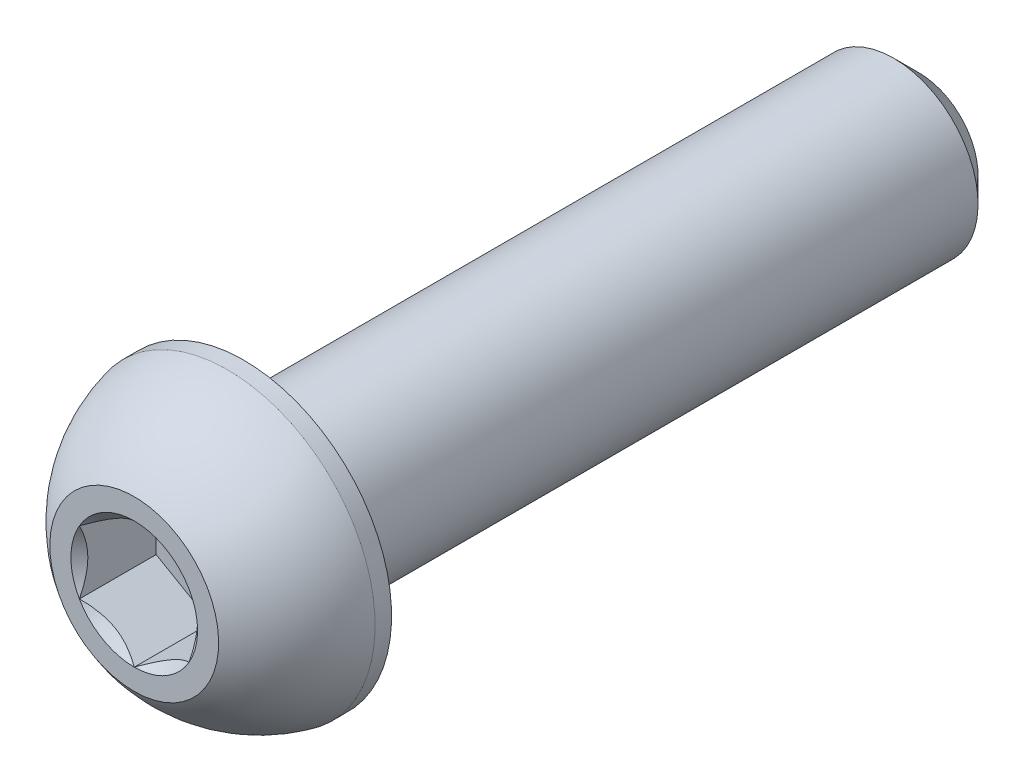
ISO-10303-21;
HEADER;
FILE_DESCRIPTION(('STEP AP214'),'2;1');
FILE_NAME('part.step','',(''),(''),'','','');
FILE_SCHEMA(('AUTOMOTIVE_DESIGN { 1 0 10303 214 1 1 1 1 }'));
ENDSEC;
DATA;
#1=APPLICATION_CONTEXT('core data for automotive mechanical design processes');
#2=APPLICATION_PROTOCOL_DEFINITION('international standard','automotive_design',2000,#1);
#3=PRODUCT_CONTEXT('',#1,'mechanical');
#4=PRODUCT('Part','Part','',(#3));
#5=PRODUCT_RELATED_PRODUCT_CATEGORY('part','',(#4));
#6=PRODUCT_DEFINITION_FORMATION('','',#4);
#7=PRODUCT_DEFINITION_CONTEXT('part definition',#1,'design');
#8=PRODUCT_DEFINITION('design','',#6,#7);
#9=PRODUCT_DEFINITION_SHAPE('','',#8);
#10=(LENGTH_UNIT() NAMED_UNIT(*) SI_UNIT(.MILLI.,.METRE.));
#11=(NAMED_UNIT(*) PLANE_ANGLE_UNIT() SI_UNIT($,.RADIAN.));
#12=(NAMED_UNIT(*) SI_UNIT($,.STERADIAN.) SOLID_ANGLE_UNIT());
#13=UNCERTAINTY_MEASURE_WITH_UNIT(LENGTH_MEASURE(1.E-05),#10,'distance_accuracy_value','');
#14=(GEOMETRIC_REPRESENTATION_CONTEXT(3) GLOBAL_UNCERTAINTY_ASSIGNED_CONTEXT((#13)) GLOBAL_UNIT_ASSIGNED_CONTEXT((#10,
#11,#12)) REPRESENTATION_CONTEXT('',''));
#15=CARTESIAN_POINT('',(0.,0.,0.));
#16=DIRECTION('',(0.,0.,1.));
#17=DIRECTION('',(1.,0.,0.));
#18=AXIS2_PLACEMENT_3D('',#15,#16,#17);
#19=CARTESIAN_POINT('',(0.,-0.750555349946513,-0.91));
#20=DIRECTION('',(0.5,-0.866025403784439,0.));
#21=DIRECTION('',(0.,0.,-1.));
#22=AXIS2_PLACEMENT_3D('',#19,#20,#21);
#23=PLANE('',#22);
#24=DIRECTION('',(0.,0.,1.));
#25=VECTOR('',#24,1.);
#26=CARTESIAN_POINT('',(0.,-0.750555349946513,-0.91));
#27=LINE('',#26,#25);
#28=CARTESIAN_POINT('',(0.,-0.750555349946513,-0.91));
#29=VERTEX_POINT('',#28);
#30=CARTESIAN_POINT('',(0.,-0.750555349946513,0.));
#31=VERTEX_POINT('',#30);
#32=EDGE_CURVE('E11',#29,#31,#27,.T.);
#33=ORIENTED_EDGE('',*,*,#32,.T.);
#34=CARTESIAN_POINT('',(2.25396322591972E-12,-0.750555349945212,-1.30128767060624E-12));
#35=CARTESIAN_POINT('',(0.325,-0.562916512459885,-0.187638837485652));
#36=CARTESIAN_POINT('',(0.649999999997747,-0.375277674974557,-1.30106096261599E-12));
#37=(BOUNDED_CURVE() B_SPLINE_CURVE(2,(#34,#35,#36),.UNSPECIFIED.,.F.,
.F.) B_SPLINE_CURVE_WITH_KNOTS((3,3),(-0.273975193232128,-0.118614470998721),
.UNSPECIFIED.) CURVE() GEOMETRIC_REPRESENTATION_ITEM() RATIONAL_B_SPLINE_CURVE((1.71400248482891,
1.97915959201189,1.71400248482891)) REPRESENTATION_ITEM(''));
#38=CARTESIAN_POINT('',(0.65,-0.375277674973256,0.));
#39=VERTEX_POINT('',#38);
#40=EDGE_CURVE('E116',#31,#39,#37,.T.);
#41=ORIENTED_EDGE('',*,*,#40,.T.);
#42=DIRECTION('',(0.,0.,1.));
#43=VECTOR('',#42,1.);
#44=CARTESIAN_POINT('',(0.65,-0.375277674973256,-0.91));
#45=LINE('',#44,#43);
#46=CARTESIAN_POINT('',(0.65,-0.375277674973256,-0.91));
#47=VERTEX_POINT('',#46);
#48=EDGE_CURVE('E111',#47,#39,#45,.T.);
#49=ORIENTED_EDGE('',*,*,#48,.F.);
#50=DIRECTION('',(0.866025403784439,0.5,0.));
#51=VECTOR('',#50,1.);
#52=CARTESIAN_POINT('',(0.,-0.750555349946513,-0.91));
#53=LINE('',#52,#51);
#54=EDGE_CURVE('E114',#29,#47,#53,.T.);
#55=ORIENTED_EDGE('',*,*,#54,.F.);
#56=EDGE_LOOP('',(#33,#41,#49,#55));
#57=FACE_BOUND('',#56,.T.);
#58=ADVANCED_FACE('F17',(#57),#23,.F.);
#59=CARTESIAN_POINT('',(-0.65,-0.375277674973257,-0.91));
#60=DIRECTION('',(-0.5,-0.866025403784439,0.));
#61=DIRECTION('',(-0.866025403784439,0.5,0.));
#62=AXIS2_PLACEMENT_3D('',#59,#60,#61);
#63=PLANE('',#62);
#64=DIRECTION('',(0.,0.,1.));
#65=VECTOR('',#64,1.);
#66=CARTESIAN_POINT('',(-0.65,-0.375277674973257,-0.91));
#67=LINE('',#66,#65);
#68=CARTESIAN_POINT('',(-0.65,-0.375277674973257,-0.91));
#69=VERTEX_POINT('',#68);
#70=CARTESIAN_POINT('',(-0.65,-0.375277674973257,0.));
#71=VERTEX_POINT('',#70);
#72=EDGE_CURVE('E28',#69,#71,#67,.T.);
#73=ORIENTED_EDGE('',*,*,#72,.T.);
#74=CARTESIAN_POINT('',(-0.649999999997745,-0.375277674974559,-1.30208114857212E-12));
#75=CARTESIAN_POINT('',(-0.325,-0.562916512459885,-0.187638837485651));
#76=CARTESIAN_POINT('',(-2.25376890478522E-12,-0.750555349945212,-1.30122289689474E-12));
#77=(BOUNDED_CURVE() B_SPLINE_CURVE(2,(#74,#75,#76),.UNSPECIFIED.,.F.,
.F.) B_SPLINE_CURVE_WITH_KNOTS((3,3),(-0.273975193232128,-0.118614470998721),
.UNSPECIFIED.) CURVE() GEOMETRIC_REPRESENTATION_ITEM() RATIONAL_B_SPLINE_CURVE((1.71400248482891,
1.97915959201189,1.71400248482891)) REPRESENTATION_ITEM(''));
#78=EDGE_CURVE('E139',#71,#31,#77,.T.);
#79=ORIENTED_EDGE('',*,*,#78,.T.);
#80=ORIENTED_EDGE('',*,*,#32,.F.);
#81=DIRECTION('',(0.866025403784439,-0.5,0.));
#82=VECTOR('',#81,1.);
#83=CARTESIAN_POINT('',(-0.65,-0.375277674973257,-0.91));
#84=LINE('',#83,#82);
#85=EDGE_CURVE('E122',#69,#29,#84,.T.);
#86=ORIENTED_EDGE('',*,*,#85,.F.);
#87=EDGE_LOOP('',(#73,#79,#80,#86));
#88=FACE_BOUND('',#87,.T.);
#89=ADVANCED_FACE('F297',(#88),#63,.F.);
#90=CARTESIAN_POINT('',(-0.65,0.375277674973256,-0.91));
#91=DIRECTION('',(-1.,0.,0.));
#92=DIRECTION('',(0.,0.,1.));
#93=AXIS2_PLACEMENT_3D('',#90,#91,#92);
#94=PLANE('',#93);
#95=DIRECTION('',(0.,0.,1.));
#96=VECTOR('',#95,1.);
#97=CARTESIAN_POINT('',(-0.65,0.375277674973256,-0.91));
#98=LINE('',#97,#96);
#99=CARTESIAN_POINT('',(-0.65,0.375277674973256,-0.91));
#100=VERTEX_POINT('',#99);
#101=CARTESIAN_POINT('',(-0.65,0.375277674973256,0.));
#102=VERTEX_POINT('',#101);
#103=EDGE_CURVE('E144',#100,#102,#98,.T.);
#104=ORIENTED_EDGE('',*,*,#103,.T.);
#105=CARTESIAN_POINT('',(-0.65,0.375277674970655,-1.30057515977974E-12));
#106=CARTESIAN_POINT('',(-0.650000000000001,0.,-0.187638837485652));
#107=CARTESIAN_POINT('',(-0.65,-0.375277674970655,-1.30081806119787E-12));
#108=(BOUNDED_CURVE() B_SPLINE_CURVE(2,(#105,#106,#107),.UNSPECIFIED.,.F.,
.F.) B_SPLINE_CURVE_WITH_KNOTS((3,3),(-0.273975193232128,-0.118614470998721),
.UNSPECIFIED.) CURVE() GEOMETRIC_REPRESENTATION_ITEM() RATIONAL_B_SPLINE_CURVE((1.71400248482891,
1.97915959201189,1.71400248482891)) REPRESENTATION_ITEM(''));
#109=EDGE_CURVE('E182',#102,#71,#108,.T.);
#110=ORIENTED_EDGE('',*,*,#109,.T.);
#111=ORIENTED_EDGE('',*,*,#72,.F.);
#112=DIRECTION('',(0.,-1.,0.));
#113=VECTOR('',#112,1.);
#114=CARTESIAN_POINT('',(-0.65,0.375277674973256,-0.91));
#115=LINE('',#114,#113);
#116=EDGE_CURVE('E196',#100,#69,#115,.T.);
#117=ORIENTED_EDGE('',*,*,#116,.F.);
#118=EDGE_LOOP('',(#104,#110,#111,#117));
#119=FACE_BOUND('',#118,.T.);
#120=ADVANCED_FACE('F302',(#119),#94,.F.);
#121=CARTESIAN_POINT('',(0.,0.750555349946513,-0.91));
#122=DIRECTION('',(-0.5,0.866025403784439,0.));
#123=DIRECTION('',(0.,0.,1.));
#124=AXIS2_PLACEMENT_3D('',#121,#122,#123);
#125=PLANE('',#124);
#126=DIRECTION('',(0.,0.,1.));
#127=VECTOR('',#126,1.);
#128=CARTESIAN_POINT('',(0.,0.750555349946513,-0.91));
#129=LINE('',#128,#127);
#130=CARTESIAN_POINT('',(0.,0.750555349946513,-0.91));
#131=VERTEX_POINT('',#130);
#132=CARTESIAN_POINT('',(0.,0.750555349946513,0.));
#133=VERTEX_POINT('',#132);
#134=EDGE_CURVE('E142',#131,#133,#129,.T.);
#135=ORIENTED_EDGE('',*,*,#134,.T.);
#136=CARTESIAN_POINT('',(-2.25399561277547E-12,0.750555349945212,-1.30106096261599E-12));
#137=CARTESIAN_POINT('',(-0.325,0.562916512459885,-0.187638837485652));
#138=CARTESIAN_POINT('',(-0.649999999997747,0.375277674974557,-1.30068851377487E-12));
#139=(BOUNDED_CURVE() B_SPLINE_CURVE(2,(#136,#137,#138),.UNSPECIFIED.,.F.,
.F.) B_SPLINE_CURVE_WITH_KNOTS((3,3),(-0.273975193232128,-0.118614470998721),
.UNSPECIFIED.) CURVE() GEOMETRIC_REPRESENTATION_ITEM() RATIONAL_B_SPLINE_CURVE((1.71400248482891,
1.97915959201188,1.71400248482891)) REPRESENTATION_ITEM(''));
#140=EDGE_CURVE('E176',#133,#102,#139,.T.);
#141=ORIENTED_EDGE('',*,*,#140,.T.);
#142=ORIENTED_EDGE('',*,*,#103,.F.);
#143=DIRECTION('',(-0.866025403784439,-0.5,0.));
#144=VECTOR('',#143,1.);
#145=CARTESIAN_POINT('',(0.,0.750555349946513,-0.91));
#146=LINE('',#145,#144);
#147=EDGE_CURVE('E192',#131,#100,#146,.T.);
#148=ORIENTED_EDGE('',*,*,#147,.F.);
#149=EDGE_LOOP('',(#135,#141,#142,#148));
#150=FACE_BOUND('',#149,.T.);
#151=ADVANCED_FACE('F314',(#150),#125,.F.);
#152=CARTESIAN_POINT('',(0.65,0.375277674973257,-0.91));
#153=DIRECTION('',(0.5,0.866025403784439,0.));
#154=DIRECTION('',(0.,0.,-1.));
#155=AXIS2_PLACEMENT_3D('',#152,#153,#154);
#156=PLANE('',#155);
#157=DIRECTION('',(0.,0.,1.));
#158=VECTOR('',#157,1.);
#159=CARTESIAN_POINT('',(0.65,0.375277674973257,-0.91));
#160=LINE('',#159,#158);
#161=CARTESIAN_POINT('',(0.65,0.375277674973257,-0.91));
#162=VERTEX_POINT('',#161);
#163=CARTESIAN_POINT('',(0.65,0.375277674973256,0.));
#164=VERTEX_POINT('',#163);
#165=EDGE_CURVE('E121',#162,#164,#160,.T.);
#166=ORIENTED_EDGE('',*,*,#165,.T.);
#167=CARTESIAN_POINT('',(0.649999999997745,0.375277674974559,-1.30214592228362E-12));
#168=CARTESIAN_POINT('',(0.324999999999999,0.562916512459886,-0.187638837485652));
#169=CARTESIAN_POINT('',(2.25279729911272E-12,0.750555349945212,-1.30070470720274E-12));
#170=(BOUNDED_CURVE() B_SPLINE_CURVE(2,(#167,#168,#169),.UNSPECIFIED.,.F.,
.F.) B_SPLINE_CURVE_WITH_KNOTS((3,3),(-0.273975193232128,-0.11861447099872),
.UNSPECIFIED.) CURVE() GEOMETRIC_REPRESENTATION_ITEM() RATIONAL_B_SPLINE_CURVE((1.71400248482891,
1.97915959201189,1.71400248482891)) REPRESENTATION_ITEM(''));
#171=EDGE_CURVE('E183',#164,#133,#170,.T.);
#172=ORIENTED_EDGE('',*,*,#171,.T.);
#173=ORIENTED_EDGE('',*,*,#134,.F.);
#174=DIRECTION('',(-0.866025403784439,0.5,0.));
#175=VECTOR('',#174,1.);
#176=CARTESIAN_POINT('',(0.65,0.375277674973257,-0.91));
#177=LINE('',#176,#175);
#178=EDGE_CURVE('E21',#162,#131,#177,.T.);
#179=ORIENTED_EDGE('',*,*,#178,.F.);
#180=EDGE_LOOP('',(#166,#172,#173,#179));
#181=FACE_BOUND('',#180,.T.);
#182=ADVANCED_FACE('F311',(#181),#156,.F.);
#183=CARTESIAN_POINT('',(0.65,-0.375277674973256,-0.91));
#184=DIRECTION('',(1.,0.,0.));
#185=DIRECTION('',(0.,1.,0.));
#186=AXIS2_PLACEMENT_3D('',#183,#184,#185);
#187=PLANE('',#186);
#188=ORIENTED_EDGE('',*,*,#48,.T.);
#189=CARTESIAN_POINT('',(0.65,-0.375277674970655,-1.30067232034699E-12));
#190=CARTESIAN_POINT('',(0.650000000000001,0.,-0.187638837485652));
#191=CARTESIAN_POINT('',(0.65,0.375277674970654,-1.30085044805362E-12));
#192=(BOUNDED_CURVE() B_SPLINE_CURVE(2,(#189,#190,#191),.UNSPECIFIED.,.F.,
.F.) B_SPLINE_CURVE_WITH_KNOTS((3,3),(-0.273975193232128,-0.118614470998721),
.UNSPECIFIED.) CURVE() GEOMETRIC_REPRESENTATION_ITEM() RATIONAL_B_SPLINE_CURVE((1.71400248482891,
1.97915959201189,1.71400248482891)) REPRESENTATION_ITEM(''));
#193=EDGE_CURVE('E228',#39,#164,#192,.T.);
#194=ORIENTED_EDGE('',*,*,#193,.T.);
#195=ORIENTED_EDGE('',*,*,#165,.F.);
#196=DIRECTION('',(0.,1.,0.));
#197=VECTOR('',#196,1.);
#198=CARTESIAN_POINT('',(0.65,-0.375277674973256,-0.91));
#199=LINE('',#198,#197);
#200=EDGE_CURVE('E125',#47,#162,#199,.T.);
#201=ORIENTED_EDGE('',*,*,#200,.F.);
#202=EDGE_LOOP('',(#188,#194,#195,#201));
#203=FACE_BOUND('',#202,.T.);
#204=ADVANCED_FACE('F126',(#203),#187,.F.);
#205=CARTESIAN_POINT('',(0.65,-0.375277674973256,-0.91));
#206=DIRECTION('',(0.,0.,1.));
#207=DIRECTION('',(1.,0.,0.));
#208=AXIS2_PLACEMENT_3D('',#205,#206,#207);
#209=PLANE('',#208);
#210=ORIENTED_EDGE('',*,*,#54,.T.);
#211=ORIENTED_EDGE('',*,*,#200,.T.);
#212=ORIENTED_EDGE('',*,*,#178,.T.);
#213=ORIENTED_EDGE('',*,*,#147,.T.);
#214=ORIENTED_EDGE('',*,*,#116,.T.);
#215=ORIENTED_EDGE('',*,*,#85,.T.);
#216=EDGE_LOOP('',(#210,#211,#212,#213,#214,#215));
#217=FACE_BOUND('',#216,.T.);
#218=ADVANCED_FACE('F132',(#217),#209,.T.);
#219=CARTESIAN_POINT('',(0.,0.,0.));
#220=DIRECTION('',(0.,0.,1.));
#221=DIRECTION('',(1.,0.,0.));
#222=AXIS2_PLACEMENT_3D('',#219,#220,#221);
#223=CONICAL_SURFACE('',#222,0.750555349946513,0.78539816339745);
#224=CARTESIAN_POINT('',(0.,0.,0.));
#225=DIRECTION('',(0.,0.,1.));
#226=DIRECTION('',(1.,0.,0.));
#227=AXIS2_PLACEMENT_3D('',#224,#225,#226);
#228=CIRCLE('',#227,0.750555349946513);
#229=EDGE_CURVE('E163',#31,#39,#228,.T.);
#230=ORIENTED_EDGE('',*,*,#229,.T.);
#231=ORIENTED_EDGE('',*,*,#40,.F.);
#232=EDGE_LOOP('',(#230,#231));
#233=FACE_BOUND('',#232,.T.);
#234=ADVANCED_FACE('F19',(#233),#223,.F.);
#235=CARTESIAN_POINT('',(0.,0.,0.));
#236=DIRECTION('',(0.,0.,1.));
#237=DIRECTION('',(1.,0.,0.));
#238=AXIS2_PLACEMENT_3D('',#235,#236,#237);
#239=CONICAL_SURFACE('',#238,0.750555349946513,0.78539816339745);
#240=CARTESIAN_POINT('',(0.,0.,0.));
#241=DIRECTION('',(0.,0.,1.));
#242=DIRECTION('',(1.,0.,0.));
#243=AXIS2_PLACEMENT_3D('',#240,#241,#242);
#244=CIRCLE('',#243,0.750555349946513);
#245=EDGE_CURVE('E166',#71,#31,#244,.T.);
#246=ORIENTED_EDGE('',*,*,#245,.T.);
#247=ORIENTED_EDGE('',*,*,#78,.F.);
#248=EDGE_LOOP('',(#246,#247));
#249=FACE_BOUND('',#248,.T.);
#250=ADVANCED_FACE('F306',(#249),#239,.F.);
#251=CARTESIAN_POINT('',(0.,0.,0.));
#252=DIRECTION('',(0.,0.,1.));
#253=DIRECTION('',(-1.,0.,0.));
#254=AXIS2_PLACEMENT_3D('',#251,#252,#253);
#255=CONICAL_SURFACE('',#254,0.750555349946513,0.78539816339745);
#256=CARTESIAN_POINT('',(0.,0.,0.));
#257=DIRECTION('',(0.,0.,1.));
#258=DIRECTION('',(1.,0.,0.));
#259=AXIS2_PLACEMENT_3D('',#256,#257,#258);
#260=CIRCLE('',#259,0.750555349946513);
#261=EDGE_CURVE('E168',#102,#71,#260,.T.);
#262=ORIENTED_EDGE('',*,*,#261,.T.);
#263=ORIENTED_EDGE('',*,*,#109,.F.);
#264=EDGE_LOOP('',(#262,#263));
#265=FACE_BOUND('',#264,.T.);
#266=ADVANCED_FACE('F309',(#265),#255,.F.);
#267=CARTESIAN_POINT('',(0.,0.,0.));
#268=DIRECTION('',(0.,0.,1.));
#269=DIRECTION('',(1.,0.,0.));
#270=AXIS2_PLACEMENT_3D('',#267,#268,#269);
#271=CONICAL_SURFACE('',#270,0.750555349946513,0.78539816339745);
#272=CARTESIAN_POINT('',(0.,0.,0.));
#273=DIRECTION('',(0.,0.,1.));
#274=DIRECTION('',(1.,0.,0.));
#275=AXIS2_PLACEMENT_3D('',#272,#273,#274);
#276=CIRCLE('',#275,0.750555349946513);
#277=EDGE_CURVE('E171',#133,#102,#276,.T.);
#278=ORIENTED_EDGE('',*,*,#277,.T.);
#279=ORIENTED_EDGE('',*,*,#140,.F.);
#280=EDGE_LOOP('',(#278,#279));
#281=FACE_BOUND('',#280,.T.);
#282=ADVANCED_FACE('F291',(#281),#271,.F.);
#283=CARTESIAN_POINT('',(0.,0.,0.));
#284=DIRECTION('',(0.,0.,1.));
#285=DIRECTION('',(1.,0.,0.));
#286=AXIS2_PLACEMENT_3D('',#283,#284,#285);
#287=CONICAL_SURFACE('',#286,0.750555349946513,0.78539816339745);
#288=CARTESIAN_POINT('',(0.,0.,0.));
#289=DIRECTION('',(0.,0.,1.));
#290=DIRECTION('',(1.,0.,0.));
#291=AXIS2_PLACEMENT_3D('',#288,#289,#290);
#292=CIRCLE('',#291,0.750555349946513);
#293=EDGE_CURVE('E167',#164,#133,#292,.T.);
#294=ORIENTED_EDGE('',*,*,#293,.T.);
#295=ORIENTED_EDGE('',*,*,#171,.F.);
#296=EDGE_LOOP('',(#294,#295));
#297=FACE_BOUND('',#296,.T.);
#298=ADVANCED_FACE('F280',(#297),#287,.F.);
#299=CARTESIAN_POINT('',(0.,-1.75,-1.3));
#300=DIRECTION('',(0.,0.,1.));
#301=DIRECTION('',(1.,0.,0.));
#302=AXIS2_PLACEMENT_3D('',#299,#300,#301);
#303=PLANE('',#302);
#304=CARTESIAN_POINT('',(0.,0.,-1.3));
#305=DIRECTION('',(0.,0.,-1.));
#306=DIRECTION('',(0.,-1.,0.));
#307=AXIS2_PLACEMENT_3D('',#304,#305,#306);
#308=CIRCLE('',#307,1.);
#309=CARTESIAN_POINT('',(0.,1.,-1.3));
#310=VERTEX_POINT('',#309);
#311=EDGE_CURVE('E211',#310,#310,#308,.T.);
#312=ORIENTED_EDGE('',*,*,#311,.F.);
#313=EDGE_LOOP('',(#312));
#314=FACE_BOUND('',#313,.T.);
#315=CARTESIAN_POINT('',(0.,0.,-1.3));
#316=DIRECTION('',(0.,0.,1.));
#317=DIRECTION('',(1.,0.,0.));
#318=AXIS2_PLACEMENT_3D('',#315,#316,#317);
#319=CIRCLE('',#318,1.75);
#320=CARTESIAN_POINT('',(-1.75,0.,-1.3));
#321=VERTEX_POINT('',#320);
#322=EDGE_CURVE('E157',#321,#321,#319,.T.);
#323=ORIENTED_EDGE('',*,*,#322,.F.);
#324=EDGE_LOOP('',(#323));
#325=FACE_BOUND('',#324,.T.);
#326=ADVANCED_FACE('F278',(#314,#325),#303,.F.);
#327=CARTESIAN_POINT('',(0.,-1.,0.));
#328=DIRECTION('',(0.,0.,-1.));
#329=DIRECTION('',(0.,-1.,0.));
#330=AXIS2_PLACEMENT_3D('',#327,#328,#329);
#331=PLANE('',#330);
#332=ORIENTED_EDGE('',*,*,#261,.F.);
#333=ORIENTED_EDGE('',*,*,#277,.F.);
#334=ORIENTED_EDGE('',*,*,#293,.F.);
#335=CARTESIAN_POINT('',(0.,0.,0.));
#336=DIRECTION('',(0.,0.,1.));
#337=DIRECTION('',(1.,0.,0.));
#338=AXIS2_PLACEMENT_3D('',#335,#336,#337);
#339=CIRCLE('',#338,0.750555349946513);
#340=EDGE_CURVE('E156',#39,#164,#339,.T.);
#341=ORIENTED_EDGE('',*,*,#340,.F.);
#342=ORIENTED_EDGE('',*,*,#229,.F.);
#343=ORIENTED_EDGE('',*,*,#245,.F.);
#344=EDGE_LOOP('',(#332,#333,#334,#341,#342,#343));
#345=FACE_BOUND('',#344,.T.);
#346=CARTESIAN_POINT('',(0.,0.,0.));
#347=DIRECTION('',(0.,0.,1.));
#348=DIRECTION('',(1.,0.,0.));
#349=AXIS2_PLACEMENT_3D('',#346,#347,#348);
#350=CIRCLE('',#349,1.);
#351=CARTESIAN_POINT('',(0.,-1.,0.));
#352=VERTEX_POINT('',#351);
#353=EDGE_CURVE('E160',#352,#352,#350,.T.);
#354=ORIENTED_EDGE('',*,*,#353,.T.);
#355=EDGE_LOOP('',(#354));
#356=FACE_BOUND('',#355,.T.);
#357=ADVANCED_FACE('F266',(#345,#356),#331,.F.);
#358=CARTESIAN_POINT('',(0.,-1.00000000000014,-9.3));
#359=DIRECTION('',(0.,0.,-1.));
#360=DIRECTION('',(-1.,0.,0.));
#361=AXIS2_PLACEMENT_3D('',#358,#359,#360);
#362=PLANE('',#361);
#363=CARTESIAN_POINT('',(0.,-1.41674866283026E-13,-9.3));
#364=DIRECTION('',(0.,0.,-1.));
#365=DIRECTION('',(0.,1.,0.));
#366=AXIS2_PLACEMENT_3D('',#363,#364,#365);
#367=CIRCLE('',#366,0.7);
#368=CARTESIAN_POINT('',(0.,0.699999999999861,-9.3));
#369=VERTEX_POINT('',#368);
#370=EDGE_CURVE('E235',#369,#369,#367,.T.);
#371=ORIENTED_EDGE('',*,*,#370,.T.);
#372=EDGE_LOOP('',(#371));
#373=FACE_BOUND('',#372,.T.);
#374=ADVANCED_FACE('F288',(#373),#362,.T.);
#375=CARTESIAN_POINT('',(0.,0.,-13.3));
#376=DIRECTION('',(0.,0.,1.));
#377=DIRECTION('',(0.,-1.,0.));
#378=AXIS2_PLACEMENT_3D('',#375,#376,#377);
#379=CYLINDRICAL_SURFACE('',#378,1.);
#380=ORIENTED_EDGE('',*,*,#311,.T.);
#381=DIRECTION('',(0.,0.,-1.));
#382=VECTOR('',#381,1.);
#383=CARTESIAN_POINT('',(0.,1.,-13.3));
#384=LINE('',#383,#382);
#385=CARTESIAN_POINT('',(0.,0.999999999999863,-9.));
#386=VERTEX_POINT('',#385);
#387=EDGE_CURVE('E172',#310,#386,#384,.T.);
#388=ORIENTED_EDGE('',*,*,#387,.T.);
#389=CARTESIAN_POINT('',(0.,-1.37189869067802E-13,-9.));
#390=DIRECTION('',(0.,0.,-1.));
#391=DIRECTION('',(0.,-1.,0.));
#392=AXIS2_PLACEMENT_3D('',#389,#390,#391);
#393=CIRCLE('',#392,1.);
#394=EDGE_CURVE('E184',#386,#386,#393,.T.);
#395=ORIENTED_EDGE('',*,*,#394,.F.);
#396=ORIENTED_EDGE('',*,*,#387,.F.);
#397=EDGE_LOOP('',(#380,#388,#395,#396));
#398=FACE_BOUND('',#397,.T.);
#399=ADVANCED_FACE('F272',(#398),#379,.T.);
#400=CARTESIAN_POINT('',(0.,0.,-1.48575791855204));
#401=DIRECTION('',(1.,0.,0.));
#402=DIRECTION('',(0.,-1.,0.));
#403=AXIS2_PLACEMENT_3D('',#400,#401,#402);
#404=SPHERICAL_SURFACE('',#403,1.790942933915);
#405=CARTESIAN_POINT('',(0.,0.,-1.48575791855204));
#406=DIRECTION('',(0.,0.,1.));
#407=DIRECTION('',(1.,0.,0.));
#408=AXIS2_PLACEMENT_3D('',#405,#406,#407);
#409=SPHERICAL_SURFACE('',#408,1.790942933915);
#410=ORIENTED_EDGE('',*,*,#353,.F.);
#411=EDGE_LOOP('',(#410));
#412=FACE_BOUND('',#411,.T.);
#413=CARTESIAN_POINT('',(0.,0.,-1.105));
#414=DIRECTION('',(0.,0.,1.));
#415=DIRECTION('',(1.,0.,0.));
#416=AXIS2_PLACEMENT_3D('',#413,#414,#415);
#417=CIRCLE('',#416,1.75);
#418=CARTESIAN_POINT('',(-1.75,0.,-1.105));
#419=VERTEX_POINT('',#418);
#420=EDGE_CURVE('E148',#419,#419,#417,.T.);
#421=ORIENTED_EDGE('',*,*,#420,.T.);
#422=EDGE_LOOP('',(#421));
#423=FACE_BOUND('',#422,.T.);
#424=ADVANCED_FACE('F268',(#412,#423),#409,.T.);
#425=CARTESIAN_POINT('',(0.,0.,0.));
#426=DIRECTION('',(0.,0.,1.));
#427=DIRECTION('',(1.,0.,0.));
#428=AXIS2_PLACEMENT_3D('',#425,#426,#427);
#429=CYLINDRICAL_SURFACE('',#428,1.75);
#430=ORIENTED_EDGE('',*,*,#420,.F.);
#431=DIRECTION('',(0.,0.,-1.));
#432=VECTOR('',#431,1.);
#433=CARTESIAN_POINT('',(-1.75,0.,0.));
#434=LINE('',#433,#432);
#435=EDGE_CURVE('E155',#419,#321,#434,.T.);
#436=ORIENTED_EDGE('',*,*,#435,.T.);
#437=ORIENTED_EDGE('',*,*,#322,.T.);
#438=ORIENTED_EDGE('',*,*,#435,.F.);
#439=EDGE_LOOP('',(#430,#436,#437,#438));
#440=FACE_BOUND('',#439,.T.);
#441=ADVANCED_FACE('F271',(#440),#429,.T.);
#442=CARTESIAN_POINT('',(0.,0.,0.));
#443=DIRECTION('',(0.,0.,1.));
#444=DIRECTION('',(1.,0.,0.));
#445=AXIS2_PLACEMENT_3D('',#442,#443,#444);
#446=CONICAL_SURFACE('',#445,0.750555349946513,0.78539816339745);
#447=ORIENTED_EDGE('',*,*,#193,.F.);
#448=ORIENTED_EDGE('',*,*,#340,.T.);
#449=EDGE_LOOP('',(#447,#448));
#450=FACE_BOUND('',#449,.T.);
#451=ADVANCED_FACE('F319',(#450),#446,.F.);
#452=CARTESIAN_POINT('',(0.,-1.41674866283026E-13,-9.3));
#453=DIRECTION('',(0.,0.,1.));
#454=DIRECTION('',(0.,-1.,0.));
#455=AXIS2_PLACEMENT_3D('',#452,#453,#454);
#456=CONICAL_SURFACE('',#455,0.7,0.785398163397445);
#457=ORIENTED_EDGE('',*,*,#394,.T.);
#458=DIRECTION('',(0.,-0.707106781186545,-0.70710678118655));
#459=VECTOR('',#458,1.);
#460=CARTESIAN_POINT('',(0.,0.699999999999861,-9.3));
#461=LINE('',#460,#459);
#462=EDGE_CURVE('E191',#386,#369,#461,.T.);
#463=ORIENTED_EDGE('',*,*,#462,.T.);
#464=ORIENTED_EDGE('',*,*,#370,.F.);
#465=ORIENTED_EDGE('',*,*,#462,.F.);
#466=EDGE_LOOP('',(#457,#463,#464,#465));
#467=FACE_BOUND('',#466,.T.);
#468=ADVANCED_FACE('F316',(#467),#456,.T.);
#469=CLOSED_SHELL('',(#58,#89,#120,#151,#182,#204,#218,#234,#250,#266,#282,#298,#326,#357,#374,
#399,#424,#441,#451,#468));
#470=MANIFOLD_SOLID_BREP('B1',#469);
#471=ADVANCED_BREP_SHAPE_REPRESENTATION('',(#18,#470),#14);
#472=SHAPE_DEFINITION_REPRESENTATION(#9,#471);
ENDSEC;
END-ISO-10303-21;
